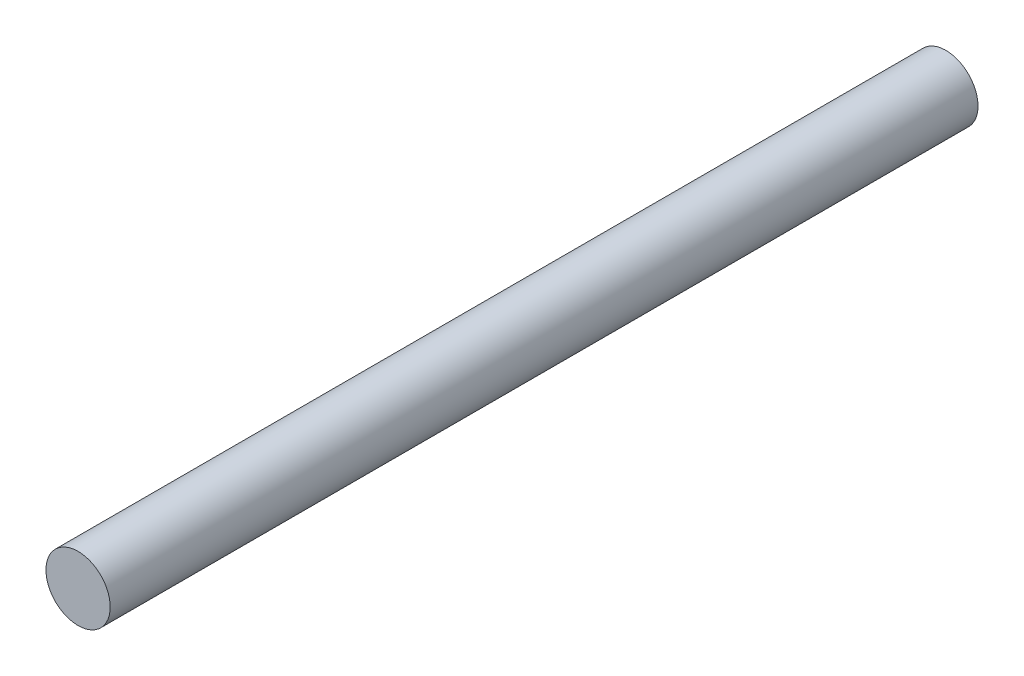
ISO-10303-21;
HEADER;
FILE_DESCRIPTION(('STEP AP214'),'2;1');
FILE_NAME('part.step','',(''),(''),'','','');
FILE_SCHEMA(('AUTOMOTIVE_DESIGN { 1 0 10303 214 1 1 1 1 }'));
ENDSEC;
DATA;
#1=APPLICATION_CONTEXT('core data for automotive mechanical design processes');
#2=APPLICATION_PROTOCOL_DEFINITION('international standard','automotive_design',2000,#1);
#3=PRODUCT_CONTEXT('',#1,'mechanical');
#4=PRODUCT('Part','Part','',(#3));
#5=PRODUCT_RELATED_PRODUCT_CATEGORY('part','',(#4));
#6=PRODUCT_DEFINITION_FORMATION('','',#4);
#7=PRODUCT_DEFINITION_CONTEXT('part definition',#1,'design');
#8=PRODUCT_DEFINITION('design','',#6,#7);
#9=PRODUCT_DEFINITION_SHAPE('','',#8);
#10=(LENGTH_UNIT() NAMED_UNIT(*) SI_UNIT(.MILLI.,.METRE.));
#11=(NAMED_UNIT(*) PLANE_ANGLE_UNIT() SI_UNIT($,.RADIAN.));
#12=(NAMED_UNIT(*) SI_UNIT($,.STERADIAN.) SOLID_ANGLE_UNIT());
#13=UNCERTAINTY_MEASURE_WITH_UNIT(LENGTH_MEASURE(1.E-05),#10,'distance_accuracy_value','');
#14=(GEOMETRIC_REPRESENTATION_CONTEXT(3) GLOBAL_UNCERTAINTY_ASSIGNED_CONTEXT((#13)) GLOBAL_UNIT_ASSIGNED_CONTEXT((#10,
#11,#12)) REPRESENTATION_CONTEXT('',''));
#15=CARTESIAN_POINT('',(0.,0.,0.));
#16=DIRECTION('',(0.,0.,1.));
#17=DIRECTION('',(1.,0.,0.));
#18=AXIS2_PLACEMENT_3D('',#15,#16,#17);
#19=CARTESIAN_POINT('',(0.,0.,270.));
#20=DIRECTION('',(0.,0.,-1.));
#21=DIRECTION('',(-1.,0.,0.));
#22=AXIS2_PLACEMENT_3D('',#19,#20,#21);
#23=CYLINDRICAL_SURFACE('',#22,10.);
#24=CARTESIAN_POINT('',(0.,0.,270.));
#25=DIRECTION('',(0.,0.,1.));
#26=DIRECTION('',(1.,0.,0.));
#27=AXIS2_PLACEMENT_3D('',#24,#25,#26);
#28=CIRCLE('',#27,10.);
#29=CARTESIAN_POINT('',(10.,0.,270.));
#30=VERTEX_POINT('',#29);
#31=EDGE_CURVE('E10',#30,#30,#28,.T.);
#32=ORIENTED_EDGE('',*,*,#31,.F.);
#33=EDGE_LOOP('',(#32));
#34=FACE_BOUND('',#33,.T.);
#35=CARTESIAN_POINT('',(0.,0.,0.));
#36=DIRECTION('',(0.,0.,1.));
#37=DIRECTION('',(1.,0.,0.));
#38=AXIS2_PLACEMENT_3D('',#35,#36,#37);
#39=CIRCLE('',#38,10.);
#40=CARTESIAN_POINT('',(10.,0.,0.));
#41=VERTEX_POINT('',#40);
#42=EDGE_CURVE('E36',#41,#41,#39,.T.);
#43=ORIENTED_EDGE('',*,*,#42,.T.);
#44=EDGE_LOOP('',(#43));
#45=FACE_BOUND('',#44,.T.);
#46=ADVANCED_FACE('F33',(#34,#45),#23,.T.);
#47=CARTESIAN_POINT('',(0.,0.,270.));
#48=DIRECTION('',(0.,0.,1.));
#49=DIRECTION('',(1.,0.,0.));
#50=AXIS2_PLACEMENT_3D('',#47,#48,#49);
#51=PLANE('',#50);
#52=ORIENTED_EDGE('',*,*,#31,.T.);
#53=EDGE_LOOP('',(#52));
#54=FACE_BOUND('',#53,.T.);
#55=ADVANCED_FACE('F48',(#54),#51,.T.);
#56=CARTESIAN_POINT('',(0.,0.,0.));
#57=DIRECTION('',(0.,0.,1.));
#58=DIRECTION('',(1.,0.,0.));
#59=AXIS2_PLACEMENT_3D('',#56,#57,#58);
#60=PLANE('',#59);
#61=ORIENTED_EDGE('',*,*,#42,.F.);
#62=EDGE_LOOP('',(#61));
#63=FACE_BOUND('',#62,.T.);
#64=ADVANCED_FACE('F46',(#63),#60,.F.);
#65=CLOSED_SHELL('',(#46,#55,#64));
#66=MANIFOLD_SOLID_BREP('B2',#65);
#67=ADVANCED_BREP_SHAPE_REPRESENTATION('',(#18,#66),#14);
#68=SHAPE_DEFINITION_REPRESENTATION(#9,#67);
ENDSEC;
END-ISO-10303-21;
